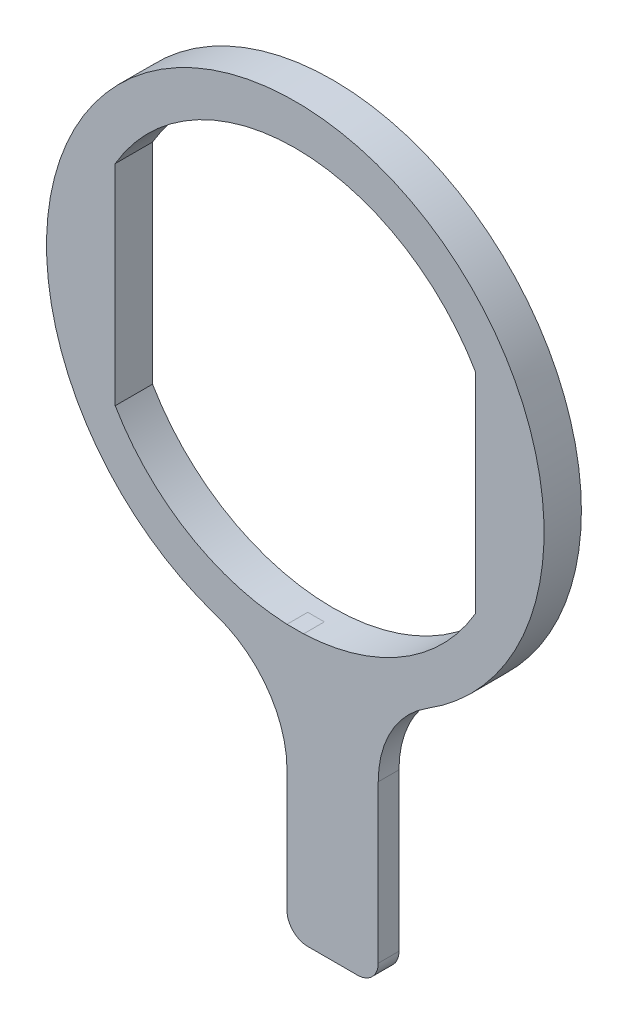
ISO-10303-21;
HEADER;
FILE_DESCRIPTION(('STEP AP214'),'2;1');
FILE_NAME('part.step','',(''),(''),'','','');
FILE_SCHEMA(('AUTOMOTIVE_DESIGN { 1 0 10303 214 1 1 1 1 }'));
ENDSEC;
DATA;
#1=APPLICATION_CONTEXT('core data for automotive mechanical design processes');
#2=APPLICATION_PROTOCOL_DEFINITION('international standard','automotive_design',2000,#1);
#3=PRODUCT_CONTEXT('',#1,'mechanical');
#4=PRODUCT('Part','Part','',(#3));
#5=PRODUCT_RELATED_PRODUCT_CATEGORY('part','',(#4));
#6=PRODUCT_DEFINITION_FORMATION('','',#4);
#7=PRODUCT_DEFINITION_CONTEXT('part definition',#1,'design');
#8=PRODUCT_DEFINITION('design','',#6,#7);
#9=PRODUCT_DEFINITION_SHAPE('','',#8);
#10=(LENGTH_UNIT() NAMED_UNIT(*) SI_UNIT(.MILLI.,.METRE.));
#11=(NAMED_UNIT(*) PLANE_ANGLE_UNIT() SI_UNIT($,.RADIAN.));
#12=(NAMED_UNIT(*) SI_UNIT($,.STERADIAN.) SOLID_ANGLE_UNIT());
#13=UNCERTAINTY_MEASURE_WITH_UNIT(LENGTH_MEASURE(1.E-05),#10,'distance_accuracy_value','');
#14=(GEOMETRIC_REPRESENTATION_CONTEXT(3) GLOBAL_UNCERTAINTY_ASSIGNED_CONTEXT((#13)) GLOBAL_UNIT_ASSIGNED_CONTEXT((#10,
#11,#12)) REPRESENTATION_CONTEXT('',''));
#15=CARTESIAN_POINT('',(0.,0.,0.));
#16=DIRECTION('',(0.,0.,1.));
#17=DIRECTION('',(1.,0.,0.));
#18=AXIS2_PLACEMENT_3D('',#15,#16,#17);
#19=CARTESIAN_POINT('',(0.,0.,1.8));
#20=DIRECTION('',(0.,0.,-1.));
#21=DIRECTION('',(-1.,0.,0.));
#22=AXIS2_PLACEMENT_3D('',#19,#20,#21);
#23=CYLINDRICAL_SURFACE('',#22,10.05);
#24=CARTESIAN_POINT('',(0.,0.,1.8));
#25=DIRECTION('',(0.,0.,1.));
#26=DIRECTION('',(1.,0.,0.));
#27=AXIS2_PLACEMENT_3D('',#24,#25,#26);
#28=CIRCLE('',#27,10.05);
#29=CARTESIAN_POINT('',(0.399999999999981,-10.0420366460196,1.8));
#30=VERTEX_POINT('',#29);
#31=CARTESIAN_POINT('',(8.68525403784439,-5.05656625568258,1.8));
#32=VERTEX_POINT('',#31);
#33=EDGE_CURVE('E150',#30,#32,#28,.T.);
#34=ORIENTED_EDGE('',*,*,#33,.T.);
#35=DIRECTION('',(0.,0.,-1.));
#36=VECTOR('',#35,1.);
#37=CARTESIAN_POINT('',(8.68525403784439,-5.05656625568258,12.0048018468587));
#38=LINE('',#37,#36);
#39=CARTESIAN_POINT('',(8.68525403784439,-5.05656625568258,0.));
#40=VERTEX_POINT('',#39);
#41=EDGE_CURVE('E137',#32,#40,#38,.T.);
#42=ORIENTED_EDGE('',*,*,#41,.T.);
#43=CARTESIAN_POINT('',(0.,0.,0.));
#44=DIRECTION('',(0.,0.,1.));
#45=DIRECTION('',(1.,0.,0.));
#46=AXIS2_PLACEMENT_3D('',#43,#44,#45);
#47=CIRCLE('',#46,10.05);
#48=CARTESIAN_POINT('',(-8.68525403784439,-5.05656625568258,0.));
#49=VERTEX_POINT('',#48);
#50=EDGE_CURVE('E170',#49,#40,#47,.T.);
#51=ORIENTED_EDGE('',*,*,#50,.F.);
#52=DIRECTION('',(0.,0.,-1.));
#53=VECTOR('',#52,1.);
#54=CARTESIAN_POINT('',(-8.68525403784439,-5.05656625568258,12.0048018468587));
#55=LINE('',#54,#53);
#56=CARTESIAN_POINT('',(-8.68525403784439,-5.05656625568258,1.8));
#57=VERTEX_POINT('',#56);
#58=EDGE_CURVE('E261',#57,#49,#55,.T.);
#59=ORIENTED_EDGE('',*,*,#58,.F.);
#60=CARTESIAN_POINT('',(-0.399999999999981,-10.0420366460196,1.8));
#61=VERTEX_POINT('',#60);
#62=EDGE_CURVE('E161',#57,#61,#28,.T.);
#63=ORIENTED_EDGE('',*,*,#62,.T.);
#64=DIRECTION('',(0.,0.,1.));
#65=VECTOR('',#64,1.);
#66=CARTESIAN_POINT('',(-0.399999999999999,-10.0420366460196,0.8));
#67=LINE('',#66,#65);
#68=CARTESIAN_POINT('',(-0.399999999999999,-10.0420366460196,0.8));
#69=VERTEX_POINT('',#68);
#70=EDGE_CURVE('E246',#69,#61,#67,.T.);
#71=ORIENTED_EDGE('',*,*,#70,.F.);
#72=CARTESIAN_POINT('',(0.,0.,0.8));
#73=DIRECTION('',(0.,0.,1.));
#74=DIRECTION('',(1.,0.,0.));
#75=AXIS2_PLACEMENT_3D('',#72,#73,#74);
#76=CIRCLE('',#75,10.05);
#77=CARTESIAN_POINT('',(0.399999999999981,-10.0420366460196,0.8));
#78=VERTEX_POINT('',#77);
#79=EDGE_CURVE('E250',#69,#78,#76,.T.);
#80=ORIENTED_EDGE('',*,*,#79,.T.);
#81=DIRECTION('',(0.,0.,-1.));
#82=VECTOR('',#81,1.);
#83=CARTESIAN_POINT('',(0.399999999999981,-10.0420366460196,1.8));
#84=LINE('',#83,#82);
#85=EDGE_CURVE('E157',#30,#78,#84,.T.);
#86=ORIENTED_EDGE('',*,*,#85,.F.);
#87=EDGE_LOOP('',(#34,#42,#51,#59,#63,#71,#80,#86));
#88=FACE_BOUND('',#87,.T.);
#89=ADVANCED_FACE('F38',(#88),#23,.F.);
#90=CARTESIAN_POINT('',(8.68525403784439,5.05656625568258,0.));
#91=VERTEX_POINT('',#90);
#92=CARTESIAN_POINT('',(-8.68525403784439,5.05656625568258,0.));
#93=VERTEX_POINT('',#92);
#94=EDGE_CURVE('E174',#91,#93,#47,.T.);
#95=ORIENTED_EDGE('',*,*,#94,.F.);
#96=DIRECTION('',(0.,0.,-1.));
#97=VECTOR('',#96,1.);
#98=CARTESIAN_POINT('',(8.68525403784439,5.05656625568258,12.0048018468587));
#99=LINE('',#98,#97);
#100=CARTESIAN_POINT('',(8.68525403784439,5.05656625568258,1.8));
#101=VERTEX_POINT('',#100);
#102=EDGE_CURVE('E478',#101,#91,#99,.T.);
#103=ORIENTED_EDGE('',*,*,#102,.F.);
#104=CARTESIAN_POINT('',(-8.68525403784439,5.05656625568258,1.8));
#105=VERTEX_POINT('',#104);
#106=EDGE_CURVE('E153',#101,#105,#28,.T.);
#107=ORIENTED_EDGE('',*,*,#106,.T.);
#108=DIRECTION('',(0.,0.,-1.));
#109=VECTOR('',#108,1.);
#110=CARTESIAN_POINT('',(-8.68525403784439,5.05656625568258,12.0048018468587));
#111=LINE('',#110,#109);
#112=EDGE_CURVE('E260',#105,#93,#111,.T.);
#113=ORIENTED_EDGE('',*,*,#112,.T.);
#114=EDGE_LOOP('',(#95,#103,#107,#113));
#115=FACE_BOUND('',#114,.T.);
#116=ADVANCED_FACE('F263',(#115),#23,.F.);
#117=CARTESIAN_POINT('',(0.,0.,1.8));
#118=DIRECTION('',(0.,0.,-1.));
#119=DIRECTION('',(-1.,0.,0.));
#120=AXIS2_PLACEMENT_3D('',#117,#118,#119);
#121=CYLINDRICAL_SURFACE('',#120,12.);
#122=CARTESIAN_POINT('',(0.,0.,1.8));
#123=DIRECTION('',(0.,0.,1.));
#124=DIRECTION('',(1.,0.,0.));
#125=AXIS2_PLACEMENT_3D('',#122,#123,#124);
#126=CIRCLE('',#125,12.);
#127=CARTESIAN_POINT('',(6.35294117647059,-10.1803800718983,1.8));
#128=VERTEX_POINT('',#127);
#129=CARTESIAN_POINT('',(-3.81176470588235,-11.3785082426032,1.8));
#130=VERTEX_POINT('',#129);
#131=EDGE_CURVE('E159',#128,#130,#126,.T.);
#132=ORIENTED_EDGE('',*,*,#131,.F.);
#133=DIRECTION('',(0.,0.,-1.));
#134=VECTOR('',#133,1.);
#135=CARTESIAN_POINT('',(6.35294117647059,-10.1803800718983,1.8));
#136=LINE('',#135,#134);
#137=CARTESIAN_POINT('',(6.35294117647059,-10.1803800718983,0.8));
#138=VERTEX_POINT('',#137);
#139=EDGE_CURVE('E181',#128,#138,#136,.T.);
#140=ORIENTED_EDGE('',*,*,#139,.T.);
#141=CARTESIAN_POINT('',(0.,0.,0.8));
#142=DIRECTION('',(0.,0.,1.));
#143=DIRECTION('',(1.,0.,0.));
#144=AXIS2_PLACEMENT_3D('',#141,#142,#143);
#145=CIRCLE('',#144,12.);
#146=CARTESIAN_POINT('',(-3.81176470588235,-11.3785082426032,0.8));
#147=VERTEX_POINT('',#146);
#148=EDGE_CURVE('E163',#147,#138,#145,.T.);
#149=ORIENTED_EDGE('',*,*,#148,.F.);
#150=DIRECTION('',(0.,0.,-1.));
#151=VECTOR('',#150,1.);
#152=CARTESIAN_POINT('',(-3.81176470588235,-11.3785082426032,1.8));
#153=LINE('',#152,#151);
#154=EDGE_CURVE('E178',#147,#130,#153,.F.);
#155=ORIENTED_EDGE('',*,*,#154,.T.);
#156=EDGE_LOOP('',(#132,#140,#149,#155));
#157=FACE_BOUND('',#156,.T.);
#158=CARTESIAN_POINT('',(0.,0.,0.));
#159=DIRECTION('',(0.,0.,1.));
#160=DIRECTION('',(1.,0.,0.));
#161=AXIS2_PLACEMENT_3D('',#158,#159,#160);
#162=CIRCLE('',#161,12.);
#163=CARTESIAN_POINT('',(12.,0.,0.));
#164=VERTEX_POINT('',#163);
#165=EDGE_CURVE('E166',#164,#164,#162,.T.);
#166=ORIENTED_EDGE('',*,*,#165,.T.);
#167=EDGE_LOOP('',(#166));
#168=FACE_BOUND('',#167,.T.);
#169=ADVANCED_FACE('F296',(#157,#168),#121,.T.);
#170=CARTESIAN_POINT('',(0.,0.,1.8));
#171=DIRECTION('',(0.,0.,1.));
#172=DIRECTION('',(1.,0.,0.));
#173=AXIS2_PLACEMENT_3D('',#170,#171,#172);
#174=PLANE('',#173);
#175=DIRECTION('',(1.,0.,0.));
#176=VECTOR('',#175,1.);
#177=CARTESIAN_POINT('',(-0.399999999999997,-23.,1.8));
#178=LINE('',#177,#176);
#179=CARTESIAN_POINT('',(0.600000000000003,-23.,1.8));
#180=VERTEX_POINT('',#179);
#181=CARTESIAN_POINT('',(3.,-23.,1.8));
#182=VERTEX_POINT('',#181);
#183=EDGE_CURVE('E234',#180,#182,#178,.T.);
#184=ORIENTED_EDGE('',*,*,#183,.T.);
#185=CARTESIAN_POINT('',(3.,-22.,1.8));
#186=DIRECTION('',(0.,0.,1.));
#187=DIRECTION('',(1.,0.,0.));
#188=AXIS2_PLACEMENT_3D('',#185,#186,#187);
#189=CIRCLE('',#188,1.);
#190=CARTESIAN_POINT('',(4.,-22.,1.8));
#191=VERTEX_POINT('',#190);
#192=EDGE_CURVE('E206',#182,#191,#189,.T.);
#193=ORIENTED_EDGE('',*,*,#192,.T.);
#194=DIRECTION('',(0.,1.,0.));
#195=VECTOR('',#194,1.);
#196=CARTESIAN_POINT('',(4.,-10.0420366460196,1.8));
#197=LINE('',#196,#195);
#198=CARTESIAN_POINT('',(4.,-14.422205101856,1.8));
#199=VERTEX_POINT('',#198);
#200=EDGE_CURVE('E233',#191,#199,#197,.T.);
#201=ORIENTED_EDGE('',*,*,#200,.T.);
#202=CARTESIAN_POINT('',(9.,-14.422205101856,1.8));
#203=DIRECTION('',(0.,0.,1.));
#204=DIRECTION('',(1.,0.,0.));
#205=AXIS2_PLACEMENT_3D('',#202,#203,#204);
#206=CIRCLE('',#205,5.);
#207=EDGE_CURVE('E192',#199,#128,#206,.F.);
#208=ORIENTED_EDGE('',*,*,#207,.T.);
#209=ORIENTED_EDGE('',*,*,#131,.T.);
#210=CARTESIAN_POINT('',(-5.4,-16.1195533436879,1.8));
#211=DIRECTION('',(0.,0.,1.));
#212=DIRECTION('',(1.,0.,0.));
#213=AXIS2_PLACEMENT_3D('',#210,#211,#212);
#214=CIRCLE('',#213,5.);
#215=CARTESIAN_POINT('',(-0.399999999999998,-16.1195533436879,1.8));
#216=VERTEX_POINT('',#215);
#217=EDGE_CURVE('E194',#130,#216,#214,.F.);
#218=ORIENTED_EDGE('',*,*,#217,.T.);
#219=DIRECTION('',(0.,-1.,0.));
#220=VECTOR('',#219,1.);
#221=CARTESIAN_POINT('',(-0.399999999999999,-10.0420366460196,1.8));
#222=LINE('',#221,#220);
#223=CARTESIAN_POINT('',(-0.399999999999997,-22.,1.8));
#224=VERTEX_POINT('',#223);
#225=EDGE_CURVE('E242',#216,#224,#222,.T.);
#226=ORIENTED_EDGE('',*,*,#225,.T.);
#227=CARTESIAN_POINT('',(0.600000000000003,-22.,1.8));
#228=DIRECTION('',(0.,0.,1.));
#229=DIRECTION('',(1.,0.,0.));
#230=AXIS2_PLACEMENT_3D('',#227,#228,#229);
#231=CIRCLE('',#230,1.);
#232=EDGE_CURVE('E204',#224,#180,#231,.T.);
#233=ORIENTED_EDGE('',*,*,#232,.T.);
#234=EDGE_LOOP('',(#184,#193,#201,#208,#209,#218,#226,#233));
#235=FACE_BOUND('',#234,.T.);
#236=ORIENTED_EDGE('',*,*,#33,.F.);
#237=DIRECTION('',(-1.,0.,0.));
#238=VECTOR('',#237,1.);
#239=CARTESIAN_POINT('',(-0.399999999999999,-10.0420366460196,1.8));
#240=LINE('',#239,#238);
#241=EDGE_CURVE('E239',#30,#61,#240,.T.);
#242=ORIENTED_EDGE('',*,*,#241,.T.);
#243=ORIENTED_EDGE('',*,*,#62,.F.);
#244=DIRECTION('',(0.,-1.,0.));
#245=VECTOR('',#244,1.);
#246=CARTESIAN_POINT('',(-8.68525403784439,0.,1.8));
#247=LINE('',#246,#245);
#248=EDGE_CURVE('E154',#105,#57,#247,.T.);
#249=ORIENTED_EDGE('',*,*,#248,.F.);
#250=ORIENTED_EDGE('',*,*,#106,.F.);
#251=DIRECTION('',(0.,-1.,0.));
#252=VECTOR('',#251,1.);
#253=CARTESIAN_POINT('',(8.68525403784439,0.,1.8));
#254=LINE('',#253,#252);
#255=EDGE_CURVE('E140',#101,#32,#254,.T.);
#256=ORIENTED_EDGE('',*,*,#255,.T.);
#257=EDGE_LOOP('',(#236,#242,#243,#249,#250,#256));
#258=FACE_BOUND('',#257,.T.);
#259=ADVANCED_FACE('F148',(#235,#258),#174,.T.);
#260=CARTESIAN_POINT('',(0.,0.,0.));
#261=DIRECTION('',(0.,0.,1.));
#262=DIRECTION('',(1.,0.,0.));
#263=AXIS2_PLACEMENT_3D('',#260,#261,#262);
#264=PLANE('',#263);
#265=ORIENTED_EDGE('',*,*,#50,.T.);
#266=DIRECTION('',(0.,-1.,0.));
#267=VECTOR('',#266,1.);
#268=CARTESIAN_POINT('',(8.68525403784439,0.,0.));
#269=LINE('',#268,#267);
#270=EDGE_CURVE('E53',#91,#40,#269,.T.);
#271=ORIENTED_EDGE('',*,*,#270,.F.);
#272=ORIENTED_EDGE('',*,*,#94,.T.);
#273=DIRECTION('',(0.,-1.,0.));
#274=VECTOR('',#273,1.);
#275=CARTESIAN_POINT('',(-8.68525403784439,0.,0.));
#276=LINE('',#275,#274);
#277=EDGE_CURVE('E58',#93,#49,#276,.T.);
#278=ORIENTED_EDGE('',*,*,#277,.T.);
#279=EDGE_LOOP('',(#265,#271,#272,#278));
#280=FACE_BOUND('',#279,.T.);
#281=ORIENTED_EDGE('',*,*,#165,.F.);
#282=EDGE_LOOP('',(#281));
#283=FACE_BOUND('',#282,.T.);
#284=ADVANCED_FACE('F253',(#280,#283),#264,.F.);
#285=CARTESIAN_POINT('',(0.,0.,0.8));
#286=DIRECTION('',(0.,0.,1.));
#287=DIRECTION('',(1.,0.,0.));
#288=AXIS2_PLACEMENT_3D('',#285,#286,#287);
#289=PLANE('',#288);
#290=DIRECTION('',(0.,1.,0.));
#291=VECTOR('',#290,1.);
#292=CARTESIAN_POINT('',(4.,-10.0420366460196,0.8));
#293=LINE('',#292,#291);
#294=CARTESIAN_POINT('',(4.,-22.,0.8));
#295=VERTEX_POINT('',#294);
#296=CARTESIAN_POINT('',(4.,-14.422205101856,0.8));
#297=VERTEX_POINT('',#296);
#298=EDGE_CURVE('E219',#295,#297,#293,.T.);
#299=ORIENTED_EDGE('',*,*,#298,.F.);
#300=CARTESIAN_POINT('',(3.,-22.,0.8));
#301=DIRECTION('',(0.,0.,1.));
#302=DIRECTION('',(1.,0.,0.));
#303=AXIS2_PLACEMENT_3D('',#300,#301,#302);
#304=CIRCLE('',#303,1.);
#305=CARTESIAN_POINT('',(3.,-23.,0.8));
#306=VERTEX_POINT('',#305);
#307=EDGE_CURVE('E46',#295,#306,#304,.F.);
#308=ORIENTED_EDGE('',*,*,#307,.T.);
#309=DIRECTION('',(1.,0.,0.));
#310=VECTOR('',#309,1.);
#311=CARTESIAN_POINT('',(-0.399999999999997,-23.,0.8));
#312=LINE('',#311,#310);
#313=CARTESIAN_POINT('',(0.600000000000003,-23.,0.8));
#314=VERTEX_POINT('',#313);
#315=EDGE_CURVE('E217',#314,#306,#312,.T.);
#316=ORIENTED_EDGE('',*,*,#315,.F.);
#317=CARTESIAN_POINT('',(0.600000000000003,-22.,0.8));
#318=DIRECTION('',(0.,0.,1.));
#319=DIRECTION('',(1.,0.,0.));
#320=AXIS2_PLACEMENT_3D('',#317,#318,#319);
#321=CIRCLE('',#320,1.);
#322=CARTESIAN_POINT('',(-0.399999999999997,-22.,0.8));
#323=VERTEX_POINT('',#322);
#324=EDGE_CURVE('E210',#314,#323,#321,.F.);
#325=ORIENTED_EDGE('',*,*,#324,.T.);
#326=DIRECTION('',(0.,-1.,0.));
#327=VECTOR('',#326,1.);
#328=CARTESIAN_POINT('',(-0.399999999999999,-10.0420366460196,0.8));
#329=LINE('',#328,#327);
#330=CARTESIAN_POINT('',(-0.399999999999998,-16.1195533436879,0.8));
#331=VERTEX_POINT('',#330);
#332=EDGE_CURVE('E228',#331,#323,#329,.T.);
#333=ORIENTED_EDGE('',*,*,#332,.F.);
#334=CARTESIAN_POINT('',(-5.4,-16.1195533436879,0.8));
#335=DIRECTION('',(0.,0.,1.));
#336=DIRECTION('',(1.,0.,0.));
#337=AXIS2_PLACEMENT_3D('',#334,#335,#336);
#338=CIRCLE('',#337,5.);
#339=EDGE_CURVE('E196',#331,#147,#338,.T.);
#340=ORIENTED_EDGE('',*,*,#339,.T.);
#341=ORIENTED_EDGE('',*,*,#148,.T.);
#342=CARTESIAN_POINT('',(9.,-14.422205101856,0.8));
#343=DIRECTION('',(0.,0.,1.));
#344=DIRECTION('',(1.,0.,0.));
#345=AXIS2_PLACEMENT_3D('',#342,#343,#344);
#346=CIRCLE('',#345,5.);
#347=EDGE_CURVE('E189',#138,#297,#346,.T.);
#348=ORIENTED_EDGE('',*,*,#347,.T.);
#349=EDGE_LOOP('',(#299,#308,#316,#325,#333,#340,#341,#348));
#350=FACE_BOUND('',#349,.T.);
#351=ADVANCED_FACE('F216',(#350),#289,.F.);
#352=CARTESIAN_POINT('',(-0.399999999999997,-23.,0.8));
#353=DIRECTION('',(0.,-1.,0.));
#354=DIRECTION('',(0.,0.,-1.));
#355=AXIS2_PLACEMENT_3D('',#352,#353,#354);
#356=PLANE('',#355);
#357=ORIENTED_EDGE('',*,*,#315,.T.);
#358=DIRECTION('',(0.,0.,1.));
#359=VECTOR('',#358,1.);
#360=CARTESIAN_POINT('',(3.,-23.,0.8));
#361=LINE('',#360,#359);
#362=EDGE_CURVE('E201',#306,#182,#361,.T.);
#363=ORIENTED_EDGE('',*,*,#362,.T.);
#364=ORIENTED_EDGE('',*,*,#183,.F.);
#365=DIRECTION('',(0.,0.,1.));
#366=VECTOR('',#365,1.);
#367=CARTESIAN_POINT('',(0.600000000000003,-23.,0.8));
#368=LINE('',#367,#366);
#369=EDGE_CURVE('E199',#180,#314,#368,.F.);
#370=ORIENTED_EDGE('',*,*,#369,.T.);
#371=EDGE_LOOP('',(#357,#363,#364,#370));
#372=FACE_BOUND('',#371,.T.);
#373=ADVANCED_FACE('F224',(#372),#356,.T.);
#374=CARTESIAN_POINT('',(4.,-10.0420366460196,0.8));
#375=DIRECTION('',(1.,0.,0.));
#376=DIRECTION('',(0.,1.,0.));
#377=AXIS2_PLACEMENT_3D('',#374,#375,#376);
#378=PLANE('',#377);
#379=ORIENTED_EDGE('',*,*,#200,.F.);
#380=DIRECTION('',(0.,0.,1.));
#381=VECTOR('',#380,1.);
#382=CARTESIAN_POINT('',(4.,-22.,0.8));
#383=LINE('',#382,#381);
#384=EDGE_CURVE('E208',#191,#295,#383,.F.);
#385=ORIENTED_EDGE('',*,*,#384,.T.);
#386=ORIENTED_EDGE('',*,*,#298,.T.);
#387=DIRECTION('',(0.,0.,-1.));
#388=VECTOR('',#387,1.);
#389=CARTESIAN_POINT('',(4.,-14.422205101856,0.8));
#390=LINE('',#389,#388);
#391=EDGE_CURVE('E184',#297,#199,#390,.F.);
#392=ORIENTED_EDGE('',*,*,#391,.T.);
#393=EDGE_LOOP('',(#379,#385,#386,#392));
#394=FACE_BOUND('',#393,.T.);
#395=ADVANCED_FACE('F236',(#394),#378,.T.);
#396=CARTESIAN_POINT('',(-0.399999999999999,-10.0420366460196,0.8));
#397=DIRECTION('',(-1.,0.,0.));
#398=DIRECTION('',(0.,-1.,0.));
#399=AXIS2_PLACEMENT_3D('',#396,#397,#398);
#400=PLANE('',#399);
#401=ORIENTED_EDGE('',*,*,#332,.T.);
#402=DIRECTION('',(0.,0.,1.));
#403=VECTOR('',#402,1.);
#404=CARTESIAN_POINT('',(-0.399999999999997,-22.,0.8));
#405=LINE('',#404,#403);
#406=EDGE_CURVE('E11',#323,#224,#405,.T.);
#407=ORIENTED_EDGE('',*,*,#406,.T.);
#408=ORIENTED_EDGE('',*,*,#225,.F.);
#409=DIRECTION('',(0.,0.,-1.));
#410=VECTOR('',#409,1.);
#411=CARTESIAN_POINT('',(-0.399999999999998,-16.1195533436879,0.8));
#412=LINE('',#411,#410);
#413=EDGE_CURVE('E187',#216,#331,#412,.T.);
#414=ORIENTED_EDGE('',*,*,#413,.T.);
#415=EDGE_LOOP('',(#401,#407,#408,#414));
#416=FACE_BOUND('',#415,.T.);
#417=ADVANCED_FACE('F276',(#416),#400,.T.);
#418=ORIENTED_EDGE('',*,*,#79,.F.);
#419=DIRECTION('',(-1.,0.,0.));
#420=VECTOR('',#419,1.);
#421=CARTESIAN_POINT('',(-0.399999999999999,-10.0420366460196,0.8));
#422=LINE('',#421,#420);
#423=EDGE_CURVE('E249',#78,#69,#422,.T.);
#424=ORIENTED_EDGE('',*,*,#423,.F.);
#425=EDGE_LOOP('',(#418,#424));
#426=FACE_BOUND('',#425,.T.);
#427=ADVANCED_FACE('F380',(#426),#289,.F.);
#428=CARTESIAN_POINT('',(-0.399999999999999,-10.0420366460196,0.8));
#429=DIRECTION('',(0.,1.,0.));
#430=DIRECTION('',(0.,0.,1.));
#431=AXIS2_PLACEMENT_3D('',#428,#429,#430);
#432=PLANE('',#431);
#433=ORIENTED_EDGE('',*,*,#241,.F.);
#434=ORIENTED_EDGE('',*,*,#85,.T.);
#435=ORIENTED_EDGE('',*,*,#423,.T.);
#436=ORIENTED_EDGE('',*,*,#70,.T.);
#437=EDGE_LOOP('',(#433,#434,#435,#436));
#438=FACE_BOUND('',#437,.T.);
#439=ADVANCED_FACE('F303',(#438),#432,.T.);
#440=CARTESIAN_POINT('',(9.,-14.422205101856,1.8));
#441=DIRECTION('',(0.,0.,-1.));
#442=DIRECTION('',(-1.,0.,0.));
#443=AXIS2_PLACEMENT_3D('',#440,#441,#442);
#444=CYLINDRICAL_SURFACE('',#443,5.);
#445=ORIENTED_EDGE('',*,*,#207,.F.);
#446=ORIENTED_EDGE('',*,*,#391,.F.);
#447=ORIENTED_EDGE('',*,*,#347,.F.);
#448=ORIENTED_EDGE('',*,*,#139,.F.);
#449=EDGE_LOOP('',(#445,#446,#447,#448));
#450=FACE_BOUND('',#449,.T.);
#451=ADVANCED_FACE('F300',(#450),#444,.F.);
#452=CARTESIAN_POINT('',(-5.4,-16.1195533436879,1.8));
#453=DIRECTION('',(0.,0.,-1.));
#454=DIRECTION('',(-1.,0.,0.));
#455=AXIS2_PLACEMENT_3D('',#452,#453,#454);
#456=CYLINDRICAL_SURFACE('',#455,5.);
#457=ORIENTED_EDGE('',*,*,#339,.F.);
#458=ORIENTED_EDGE('',*,*,#413,.F.);
#459=ORIENTED_EDGE('',*,*,#217,.F.);
#460=ORIENTED_EDGE('',*,*,#154,.F.);
#461=EDGE_LOOP('',(#457,#458,#459,#460));
#462=FACE_BOUND('',#461,.T.);
#463=ADVANCED_FACE('F281',(#462),#456,.F.);
#464=CARTESIAN_POINT('',(3.,-22.,0.8));
#465=DIRECTION('',(0.,0.,1.));
#466=DIRECTION('',(1.,0.,0.));
#467=AXIS2_PLACEMENT_3D('',#464,#465,#466);
#468=CYLINDRICAL_SURFACE('',#467,1.);
#469=ORIENTED_EDGE('',*,*,#307,.F.);
#470=ORIENTED_EDGE('',*,*,#384,.F.);
#471=ORIENTED_EDGE('',*,*,#192,.F.);
#472=ORIENTED_EDGE('',*,*,#362,.F.);
#473=EDGE_LOOP('',(#469,#470,#471,#472));
#474=FACE_BOUND('',#473,.T.);
#475=ADVANCED_FACE('F230',(#474),#468,.T.);
#476=CARTESIAN_POINT('',(0.600000000000003,-22.,0.8));
#477=DIRECTION('',(0.,0.,1.));
#478=DIRECTION('',(1.,0.,0.));
#479=AXIS2_PLACEMENT_3D('',#476,#477,#478);
#480=CYLINDRICAL_SURFACE('',#479,1.);
#481=ORIENTED_EDGE('',*,*,#324,.F.);
#482=ORIENTED_EDGE('',*,*,#369,.F.);
#483=ORIENTED_EDGE('',*,*,#232,.F.);
#484=ORIENTED_EDGE('',*,*,#406,.F.);
#485=EDGE_LOOP('',(#481,#482,#483,#484));
#486=FACE_BOUND('',#485,.T.);
#487=ADVANCED_FACE('F40',(#486),#480,.T.);
#488=CARTESIAN_POINT('',(-8.68525403784439,0.,12.0048018468587));
#489=DIRECTION('',(1.,0.,0.));
#490=DIRECTION('',(0.,0.,-1.));
#491=AXIS2_PLACEMENT_3D('',#488,#489,#490);
#492=PLANE('',#491);
#493=ORIENTED_EDGE('',*,*,#112,.F.);
#494=ORIENTED_EDGE('',*,*,#248,.T.);
#495=ORIENTED_EDGE('',*,*,#58,.T.);
#496=ORIENTED_EDGE('',*,*,#277,.F.);
#497=EDGE_LOOP('',(#493,#494,#495,#496));
#498=FACE_BOUND('',#497,.T.);
#499=ADVANCED_FACE('F259',(#498),#492,.T.);
#500=CARTESIAN_POINT('',(8.68525403784439,0.,12.0048018468587));
#501=DIRECTION('',(1.,0.,0.));
#502=DIRECTION('',(0.,0.,-1.));
#503=AXIS2_PLACEMENT_3D('',#500,#501,#502);
#504=PLANE('',#503);
#505=ORIENTED_EDGE('',*,*,#255,.F.);
#506=ORIENTED_EDGE('',*,*,#102,.T.);
#507=ORIENTED_EDGE('',*,*,#270,.T.);
#508=ORIENTED_EDGE('',*,*,#41,.F.);
#509=EDGE_LOOP('',(#505,#506,#507,#508));
#510=FACE_BOUND('',#509,.T.);
#511=ADVANCED_FACE('F139',(#510),#504,.F.);
#512=CLOSED_SHELL('',(#89,#116,#169,#259,#284,#351,#373,#395,#417,#427,#439,#451,#463,#475,#487,
#499,#511));
#513=MANIFOLD_SOLID_BREP('B2',#512);
#514=ADVANCED_BREP_SHAPE_REPRESENTATION('',(#18,#513),#14);
#515=SHAPE_DEFINITION_REPRESENTATION(#9,#514);
ENDSEC;
END-ISO-10303-21;
